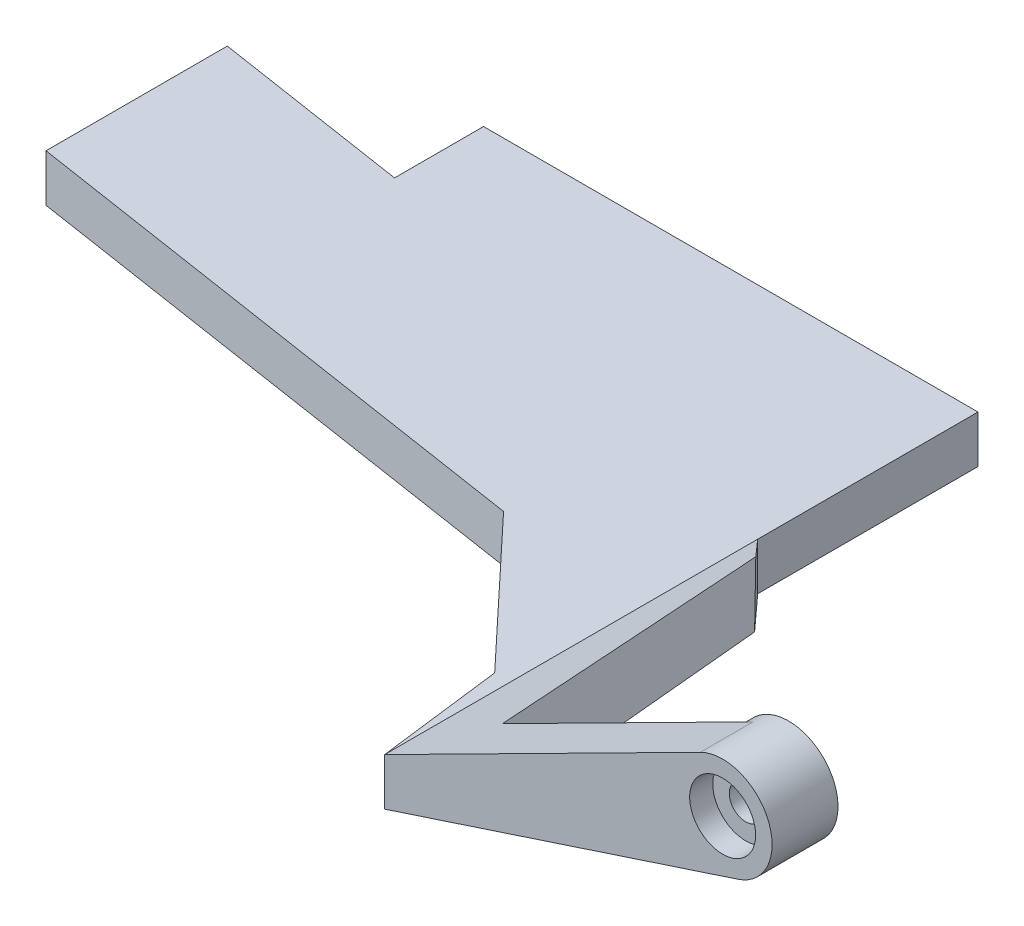
ISO-10303-21;
HEADER;
FILE_DESCRIPTION(('STEP AP214'),'2;1');
FILE_NAME('part.step','',(''),(''),'','','');
FILE_SCHEMA(('AUTOMOTIVE_DESIGN { 1 0 10303 214 1 1 1 1 }'));
ENDSEC;
DATA;
#1=APPLICATION_CONTEXT('core data for automotive mechanical design processes');
#2=APPLICATION_PROTOCOL_DEFINITION('international standard','automotive_design',2000,#1);
#3=PRODUCT_CONTEXT('',#1,'mechanical');
#4=PRODUCT('Part','Part','',(#3));
#5=PRODUCT_RELATED_PRODUCT_CATEGORY('part','',(#4));
#6=PRODUCT_DEFINITION_FORMATION('','',#4);
#7=PRODUCT_DEFINITION_CONTEXT('part definition',#1,'design');
#8=PRODUCT_DEFINITION('design','',#6,#7);
#9=PRODUCT_DEFINITION_SHAPE('','',#8);
#10=(LENGTH_UNIT() NAMED_UNIT(*) SI_UNIT(.MILLI.,.METRE.));
#11=(NAMED_UNIT(*) PLANE_ANGLE_UNIT() SI_UNIT($,.RADIAN.));
#12=(NAMED_UNIT(*) SI_UNIT($,.STERADIAN.) SOLID_ANGLE_UNIT());
#13=UNCERTAINTY_MEASURE_WITH_UNIT(LENGTH_MEASURE(1.E-05),#10,'distance_accuracy_value','');
#14=(GEOMETRIC_REPRESENTATION_CONTEXT(3) GLOBAL_UNCERTAINTY_ASSIGNED_CONTEXT((#13)) GLOBAL_UNIT_ASSIGNED_CONTEXT((#10,
#11,#12)) REPRESENTATION_CONTEXT('',''));
#15=CARTESIAN_POINT('',(0.,0.,0.));
#16=DIRECTION('',(0.,0.,1.));
#17=DIRECTION('',(1.,0.,0.));
#18=AXIS2_PLACEMENT_3D('',#15,#16,#17);
#19=CARTESIAN_POINT('',(-41.2676026719527,-17.5483263386241,-80.));
#20=DIRECTION('',(0.,1.,0.));
#21=DIRECTION('',(-1.,0.,0.));
#22=AXIS2_PLACEMENT_3D('',#19,#20,#21);
#23=PLANE('',#22);
#24=DIRECTION('',(-0.988277380271317,0.,-0.152668987171799));
#25=VECTOR('',#24,1.);
#26=CARTESIAN_POINT('',(-46.0414001066673,-17.5483263386241,-28.1514635135934));
#27=LINE('',#26,#25);
#28=CARTESIAN_POINT('',(-64.1813932684449,-17.5483263386243,-30.9537277752237));
#29=VERTEX_POINT('',#28);
#30=CARTESIAN_POINT('',(-146.267602671953,-17.5483263386243,-43.6343968875384));
#31=VERTEX_POINT('',#30);
#32=EDGE_CURVE('E76',#29,#31,#27,.T.);
#33=ORIENTED_EDGE('',*,*,#32,.F.);
#34=DIRECTION('',(-0.684229729304495,0.,-0.729266533947567));
#35=VECTOR('',#34,1.);
#36=CARTESIAN_POINT('',(-43.6545013893101,-17.5483263386241,-9.0757317567967));
#37=LINE('',#36,#35);
#38=CARTESIAN_POINT('',(-43.6545013893101,-17.5483263386241,-9.0757317567967));
#39=VERTEX_POINT('',#38);
#40=EDGE_CURVE('E323',#39,#29,#37,.T.);
#41=ORIENTED_EDGE('',*,*,#40,.F.);
#42=DIRECTION('',(-0.124159305403862,0.,-0.992262297420209));
#43=VECTOR('',#42,1.);
#44=CARTESIAN_POINT('',(-41.2676026719527,-17.5483263386241,10.));
#45=LINE('',#44,#43);
#46=CARTESIAN_POINT('',(-41.2676026719527,-17.5483263386241,10.));
#47=VERTEX_POINT('',#46);
#48=EDGE_CURVE('E289',#47,#39,#45,.T.);
#49=ORIENTED_EDGE('',*,*,#48,.F.);
#50=DIRECTION('',(0.,0.,1.));
#51=VECTOR('',#50,1.);
#52=CARTESIAN_POINT('',(-41.2676026719527,-17.5483263386241,2.));
#53=LINE('',#52,#51);
#54=CARTESIAN_POINT('',(-41.2676026719527,-17.5483263386241,-46.5823410297636));
#55=VERTEX_POINT('',#54);
#56=EDGE_CURVE('E219',#55,#47,#53,.T.);
#57=ORIENTED_EDGE('',*,*,#56,.F.);
#58=DIRECTION('',(0.,0.,1.));
#59=VECTOR('',#58,1.);
#60=CARTESIAN_POINT('',(-41.2676026719527,-17.5483263386241,-80.));
#61=LINE('',#60,#59);
#62=CARTESIAN_POINT('',(-41.2676026719527,-17.5483263386241,-80.));
#63=VERTEX_POINT('',#62);
#64=EDGE_CURVE('E260',#63,#55,#61,.T.);
#65=ORIENTED_EDGE('',*,*,#64,.F.);
#66=DIRECTION('',(-1.,0.,0.));
#67=VECTOR('',#66,1.);
#68=CARTESIAN_POINT('',(-41.2676026719527,-17.5483263386241,-80.));
#69=LINE('',#68,#67);
#70=CARTESIAN_POINT('',(-116.267602671953,-17.5483263386241,-80.));
#71=VERTEX_POINT('',#70);
#72=EDGE_CURVE('E228',#63,#71,#69,.T.);
#73=ORIENTED_EDGE('',*,*,#72,.T.);
#74=DIRECTION('',(0.,0.,1.));
#75=VECTOR('',#74,1.);
#76=CARTESIAN_POINT('',(-116.267602671953,-17.5483263386241,-80.));
#77=LINE('',#76,#75);
#78=CARTESIAN_POINT('',(-116.267602671953,-17.5483263386241,-66.5));
#79=VERTEX_POINT('',#78);
#80=EDGE_CURVE('E193',#71,#79,#77,.T.);
#81=ORIENTED_EDGE('',*,*,#80,.T.);
#82=DIRECTION('',(0.988277380271317,0.,0.152668987171799));
#83=VECTOR('',#82,1.);
#84=CARTESIAN_POINT('',(-146.267602671953,-17.5483263386243,-71.1343968875384));
#85=LINE('',#84,#83);
#86=CARTESIAN_POINT('',(-146.267602671953,-17.5483263386243,-71.1343968875384));
#87=VERTEX_POINT('',#86);
#88=EDGE_CURVE('E287',#87,#79,#85,.T.);
#89=ORIENTED_EDGE('',*,*,#88,.F.);
#90=DIRECTION('',(0.,0.,-1.));
#91=VECTOR('',#90,1.);
#92=CARTESIAN_POINT('',(-146.267602671953,-17.5483263386243,-59.5));
#93=LINE('',#92,#91);
#94=EDGE_CURVE('E280',#31,#87,#93,.T.);
#95=ORIENTED_EDGE('',*,*,#94,.F.);
#96=EDGE_LOOP('',(#33,#41,#49,#57,#65,#73,#81,#89,#95));
#97=FACE_BOUND('',#96,.T.);
#98=ADVANCED_FACE('F53',(#97),#23,.T.);
#99=CARTESIAN_POINT('',(-41.2676026719527,-24.7170529321878,-80.));
#100=DIRECTION('',(0.,1.,0.));
#101=DIRECTION('',(-1.,0.,0.));
#102=AXIS2_PLACEMENT_3D('',#99,#100,#101);
#103=PLANE('',#102);
#104=DIRECTION('',(0.,0.,1.));
#105=VECTOR('',#104,1.);
#106=CARTESIAN_POINT('',(-41.2676026719527,-24.7170529321878,-80.));
#107=LINE('',#106,#105);
#108=CARTESIAN_POINT('',(-41.2676026719527,-24.7170529321878,-80.));
#109=VERTEX_POINT('',#108);
#110=CARTESIAN_POINT('',(-41.2676026719527,-24.7170529321878,-46.5823410297636));
#111=VERTEX_POINT('',#110);
#112=EDGE_CURVE('E223',#109,#111,#107,.T.);
#113=ORIENTED_EDGE('',*,*,#112,.T.);
#114=DIRECTION('',(0.,0.,1.));
#115=VECTOR('',#114,1.);
#116=CARTESIAN_POINT('',(-41.2676026719527,-24.7170529321878,2.));
#117=LINE('',#116,#115);
#118=CARTESIAN_POINT('',(-41.2676026719527,-24.7170529321883,10.));
#119=VERTEX_POINT('',#118);
#120=EDGE_CURVE('E68',#111,#119,#117,.T.);
#121=ORIENTED_EDGE('',*,*,#120,.T.);
#122=DIRECTION('',(-0.124159305403862,0.,-0.992262297420209));
#123=VECTOR('',#122,1.);
#124=CARTESIAN_POINT('',(-41.2676026719527,-24.7170529321883,10.));
#125=LINE('',#124,#123);
#126=CARTESIAN_POINT('',(-43.65450138931,-24.7170529321878,-9.0757317567967));
#127=VERTEX_POINT('',#126);
#128=EDGE_CURVE('E301',#119,#127,#125,.T.);
#129=ORIENTED_EDGE('',*,*,#128,.T.);
#130=DIRECTION('',(-0.684229729304495,0.,-0.729266533947567));
#131=VECTOR('',#130,1.);
#132=CARTESIAN_POINT('',(-43.65450138931,-24.7170529321878,-9.0757317567967));
#133=LINE('',#132,#131);
#134=CARTESIAN_POINT('',(-64.1813932684448,-24.7170529321879,-30.9537277752237));
#135=VERTEX_POINT('',#134);
#136=EDGE_CURVE('E311',#127,#135,#133,.T.);
#137=ORIENTED_EDGE('',*,*,#136,.T.);
#138=DIRECTION('',(-0.988277380271317,0.,-0.152668987171799));
#139=VECTOR('',#138,1.);
#140=CARTESIAN_POINT('',(-46.0414001066673,-24.7170529321883,-28.1514635135934));
#141=LINE('',#140,#139);
#142=CARTESIAN_POINT('',(-146.267602671953,-24.7170529321885,-43.6343968875384));
#143=VERTEX_POINT('',#142);
#144=EDGE_CURVE('E175',#135,#143,#141,.T.);
#145=ORIENTED_EDGE('',*,*,#144,.T.);
#146=DIRECTION('',(0.,0.,-1.));
#147=VECTOR('',#146,1.);
#148=CARTESIAN_POINT('',(-146.267602671953,-24.7170529321885,-59.5));
#149=LINE('',#148,#147);
#150=CARTESIAN_POINT('',(-146.267602671953,-24.7170529321885,-71.1343968875384));
#151=VERTEX_POINT('',#150);
#152=EDGE_CURVE('E282',#143,#151,#149,.T.);
#153=ORIENTED_EDGE('',*,*,#152,.T.);
#154=DIRECTION('',(0.988277380271317,0.,0.152668987171799));
#155=VECTOR('',#154,1.);
#156=CARTESIAN_POINT('',(-146.267602671953,-24.7170529321885,-71.1343968875384));
#157=LINE('',#156,#155);
#158=CARTESIAN_POINT('',(-116.267602671953,-24.7170529321883,-66.5));
#159=VERTEX_POINT('',#158);
#160=EDGE_CURVE('E316',#151,#159,#157,.T.);
#161=ORIENTED_EDGE('',*,*,#160,.T.);
#162=DIRECTION('',(0.,0.,1.));
#163=VECTOR('',#162,1.);
#164=CARTESIAN_POINT('',(-116.267602671953,-24.7170529321883,-80.));
#165=LINE('',#164,#163);
#166=CARTESIAN_POINT('',(-116.267602671953,-24.7170529321883,-80.));
#167=VERTEX_POINT('',#166);
#168=EDGE_CURVE('E252',#167,#159,#165,.T.);
#169=ORIENTED_EDGE('',*,*,#168,.F.);
#170=DIRECTION('',(-1.,0.,0.));
#171=VECTOR('',#170,1.);
#172=CARTESIAN_POINT('',(-41.2676026719527,-24.7170529321878,-80.));
#173=LINE('',#172,#171);
#174=EDGE_CURVE('E256',#109,#167,#173,.T.);
#175=ORIENTED_EDGE('',*,*,#174,.F.);
#176=EDGE_LOOP('',(#113,#121,#129,#137,#145,#153,#161,#169,#175));
#177=FACE_BOUND('',#176,.T.);
#178=ADVANCED_FACE('F309',(#177),#103,.F.);
#179=CARTESIAN_POINT('',(-146.267602671953,-17.5483263386243,-59.5));
#180=DIRECTION('',(-1.,0.,0.));
#181=DIRECTION('',(0.,-1.,0.));
#182=AXIS2_PLACEMENT_3D('',#179,#180,#181);
#183=PLANE('',#182);
#184=ORIENTED_EDGE('',*,*,#152,.F.);
#185=DIRECTION('',(0.,1.,0.));
#186=VECTOR('',#185,1.);
#187=CARTESIAN_POINT('',(-146.267602671953,-17.5483263386243,-43.6343968875384));
#188=LINE('',#187,#186);
#189=EDGE_CURVE('E62',#143,#31,#188,.T.);
#190=ORIENTED_EDGE('',*,*,#189,.T.);
#191=ORIENTED_EDGE('',*,*,#94,.T.);
#192=DIRECTION('',(0.,-1.,0.));
#193=VECTOR('',#192,1.);
#194=CARTESIAN_POINT('',(-146.267602671953,-17.5483263386243,-71.1343968875384));
#195=LINE('',#194,#193);
#196=EDGE_CURVE('E298',#87,#151,#195,.T.);
#197=ORIENTED_EDGE('',*,*,#196,.T.);
#198=EDGE_LOOP('',(#184,#190,#191,#197));
#199=FACE_BOUND('',#198,.T.);
#200=ADVANCED_FACE('F278',(#199),#183,.T.);
#201=CARTESIAN_POINT('',(10.,0.,2.));
#202=DIRECTION('',(0.,0.,1.));
#203=DIRECTION('',(1.,0.,0.));
#204=AXIS2_PLACEMENT_3D('',#201,#202,#203);
#205=PLANE('',#204);
#206=CARTESIAN_POINT('',(10.,0.,2.));
#207=DIRECTION('',(0.,0.,-1.));
#208=DIRECTION('',(1.,0.,0.));
#209=AXIS2_PLACEMENT_3D('',#206,#207,#208);
#210=CIRCLE('',#209,7.5);
#211=CARTESIAN_POINT('',(12.3384512309936,-7.12612418080576,2.));
#212=VERTEX_POINT('',#211);
#213=CARTESIAN_POINT('',(6.61243550204485,6.69136807926405,2.));
#214=VERTEX_POINT('',#213);
#215=EDGE_CURVE('E215',#212,#214,#210,.T.);
#216=ORIENTED_EDGE('',*,*,#215,.F.);
#217=DIRECTION('',(0.950149890774101,0.311793497465814,0.));
#218=VECTOR('',#217,1.);
#219=CARTESIAN_POINT('',(-41.2676026719527,-24.7170529321878,2.));
#220=LINE('',#219,#218);
#221=CARTESIAN_POINT('',(-28.7525984690317,-20.6102304517378,2.));
#222=VERTEX_POINT('',#221);
#223=EDGE_CURVE('E181',#222,#212,#220,.T.);
#224=ORIENTED_EDGE('',*,*,#223,.F.);
#225=DIRECTION('',(0.311793497465814,-0.950149890774101,0.));
#226=VECTOR('',#225,1.);
#227=CARTESIAN_POINT('',(-45.588057242819,30.6936275345875,2.));
#228=LINE('',#227,#226);
#229=CARTESIAN_POINT('',(-31.397145388891,-12.5513197064078,2.));
#230=VERTEX_POINT('',#229);
#231=EDGE_CURVE('E167',#230,#222,#228,.T.);
#232=ORIENTED_EDGE('',*,*,#231,.F.);
#233=DIRECTION('',(-0.89218241056854,-0.45167526639402,0.));
#234=VECTOR('',#233,1.);
#235=CARTESIAN_POINT('',(-41.2676026719527,-17.5483263386241,2.));
#236=LINE('',#235,#234);
#237=EDGE_CURVE('E235',#214,#230,#236,.T.);
#238=ORIENTED_EDGE('',*,*,#237,.F.);
#239=EDGE_LOOP('',(#216,#224,#232,#238));
#240=FACE_BOUND('',#239,.T.);
#241=ADVANCED_FACE('F372',(#240),#205,.F.);
#242=CARTESIAN_POINT('',(-41.2676026719527,-24.7170529321878,2.));
#243=DIRECTION('',(0.311793497465814,-0.950149890774101,0.));
#244=DIRECTION('',(0.950149890774101,0.311793497465814,0.));
#245=AXIS2_PLACEMENT_3D('',#242,#243,#244);
#246=PLANE('',#245);
#247=DIRECTION('',(-0.130481720878271,-0.0428178253800029,-0.990525695954614));
#248=VECTOR('',#247,1.);
#249=CARTESIAN_POINT('',(-28.7525984690317,-20.6102304517378,2.));
#250=LINE('',#249,#248);
#251=CARTESIAN_POINT('',(-34.1535189881642,-22.3825528132373,-39.));
#252=VERTEX_POINT('',#251);
#253=EDGE_CURVE('E163',#222,#252,#250,.T.);
#254=ORIENTED_EDGE('',*,*,#253,.F.);
#255=ORIENTED_EDGE('',*,*,#223,.T.);
#256=DIRECTION('',(0.,0.,1.));
#257=VECTOR('',#256,1.);
#258=CARTESIAN_POINT('',(12.3384512309936,-7.12612418080576,2.));
#259=LINE('',#258,#257);
#260=CARTESIAN_POINT('',(12.3384512309936,-7.12612418080576,10.));
#261=VERTEX_POINT('',#260);
#262=EDGE_CURVE('E224',#212,#261,#259,.T.);
#263=ORIENTED_EDGE('',*,*,#262,.T.);
#264=DIRECTION('',(0.950149890774101,0.311793497465814,0.));
#265=VECTOR('',#264,1.);
#266=CARTESIAN_POINT('',(-41.2676026719527,-24.7170529321878,10.));
#267=LINE('',#266,#265);
#268=EDGE_CURVE('E198',#119,#261,#267,.T.);
#269=ORIENTED_EDGE('',*,*,#268,.F.);
#270=ORIENTED_EDGE('',*,*,#120,.F.);
#271=DIRECTION('',(0.667608146166294,0.219076885500904,0.711550898679516));
#272=VECTOR('',#271,1.);
#273=CARTESIAN_POINT('',(-33.0954907047821,-22.0353588156416,-37.8723310519922));
#274=LINE('',#273,#272);
#275=EDGE_CURVE('E12',#111,#252,#274,.T.);
#276=ORIENTED_EDGE('',*,*,#275,.T.);
#277=EDGE_LOOP('',(#254,#255,#263,#269,#270,#276));
#278=FACE_BOUND('',#277,.T.);
#279=ADVANCED_FACE('F55',(#278),#246,.T.);
#280=CARTESIAN_POINT('',(10.,0.,10.));
#281=DIRECTION('',(0.,0.,-1.));
#282=DIRECTION('',(-1.,0.,0.));
#283=AXIS2_PLACEMENT_3D('',#280,#281,#282);
#284=CYLINDRICAL_SURFACE('',#283,5.);
#285=CARTESIAN_POINT('',(10.,0.,3.));
#286=DIRECTION('',(0.,0.,1.));
#287=DIRECTION('',(1.,0.,0.));
#288=AXIS2_PLACEMENT_3D('',#285,#286,#287);
#289=CIRCLE('',#288,5.);
#290=CARTESIAN_POINT('',(15.,0.,3.));
#291=VERTEX_POINT('',#290);
#292=EDGE_CURVE('E188',#291,#291,#289,.T.);
#293=ORIENTED_EDGE('',*,*,#292,.T.);
#294=EDGE_LOOP('',(#293));
#295=FACE_BOUND('',#294,.T.);
#296=CARTESIAN_POINT('',(10.,0.,0.));
#297=DIRECTION('',(0.,0.,1.));
#298=DIRECTION('',(1.,0.,0.));
#299=AXIS2_PLACEMENT_3D('',#296,#297,#298);
#300=CIRCLE('',#299,5.);
#301=CARTESIAN_POINT('',(15.,0.,0.));
#302=VERTEX_POINT('',#301);
#303=EDGE_CURVE('E214',#302,#302,#300,.T.);
#304=ORIENTED_EDGE('',*,*,#303,.F.);
#305=EDGE_LOOP('',(#304));
#306=FACE_BOUND('',#305,.T.);
#307=ADVANCED_FACE('F380',(#295,#306),#284,.F.);
#308=CARTESIAN_POINT('',(10.,0.,3.));
#309=DIRECTION('',(0.,0.,1.));
#310=DIRECTION('',(1.,0.,0.));
#311=AXIS2_PLACEMENT_3D('',#308,#309,#310);
#312=CYLINDRICAL_SURFACE('',#311,2.49999999999999);
#313=CARTESIAN_POINT('',(10.,0.,3.));
#314=DIRECTION('',(0.,0.,1.));
#315=DIRECTION('',(1.,0.,0.));
#316=AXIS2_PLACEMENT_3D('',#313,#314,#315);
#317=CIRCLE('',#316,2.49999999999999);
#318=CARTESIAN_POINT('',(12.5,0.,3.));
#319=VERTEX_POINT('',#318);
#320=EDGE_CURVE('E194',#319,#319,#317,.T.);
#321=ORIENTED_EDGE('',*,*,#320,.F.);
#322=EDGE_LOOP('',(#321));
#323=FACE_BOUND('',#322,.T.);
#324=CARTESIAN_POINT('',(10.,0.,6.49999999999999));
#325=DIRECTION('',(0.,0.,1.));
#326=DIRECTION('',(1.,0.,0.));
#327=AXIS2_PLACEMENT_3D('',#324,#325,#326);
#328=CIRCLE('',#327,2.49999999999999);
#329=CARTESIAN_POINT('',(12.5,0.,6.49999999999999));
#330=VERTEX_POINT('',#329);
#331=EDGE_CURVE('E182',#330,#330,#328,.F.);
#332=ORIENTED_EDGE('',*,*,#331,.F.);
#333=EDGE_LOOP('',(#332));
#334=FACE_BOUND('',#333,.T.);
#335=ADVANCED_FACE('F410',(#323,#334),#312,.F.);
#336=CARTESIAN_POINT('',(0.,0.,10.));
#337=DIRECTION('',(0.,0.,1.));
#338=DIRECTION('',(1.,0.,0.));
#339=AXIS2_PLACEMENT_3D('',#336,#337,#338);
#340=PLANE('',#339);
#341=DIRECTION('',(0.,1.,0.));
#342=VECTOR('',#341,1.);
#343=CARTESIAN_POINT('',(-41.2676026719527,-24.7170529321883,10.));
#344=LINE('',#343,#342);
#345=EDGE_CURVE('E169',#119,#47,#344,.T.);
#346=ORIENTED_EDGE('',*,*,#345,.F.);
#347=ORIENTED_EDGE('',*,*,#268,.T.);
#348=CARTESIAN_POINT('',(10.,0.,10.));
#349=DIRECTION('',(0.,0.,1.));
#350=DIRECTION('',(1.,0.,0.));
#351=AXIS2_PLACEMENT_3D('',#348,#349,#350);
#352=CIRCLE('',#351,7.5);
#353=CARTESIAN_POINT('',(6.61243550204485,6.69136807926405,10.));
#354=VERTEX_POINT('',#353);
#355=EDGE_CURVE('E192',#261,#354,#352,.T.);
#356=ORIENTED_EDGE('',*,*,#355,.T.);
#357=DIRECTION('',(-0.89218241056854,-0.45167526639402,0.));
#358=VECTOR('',#357,1.);
#359=CARTESIAN_POINT('',(-41.2676026719527,-17.5483263386241,10.));
#360=LINE('',#359,#358);
#361=EDGE_CURVE('E209',#354,#47,#360,.T.);
#362=ORIENTED_EDGE('',*,*,#361,.T.);
#363=EDGE_LOOP('',(#346,#347,#356,#362));
#364=FACE_BOUND('',#363,.T.);
#365=CARTESIAN_POINT('',(10.,0.,10.));
#366=DIRECTION('',(0.,0.,1.));
#367=DIRECTION('',(1.,0.,0.));
#368=AXIS2_PLACEMENT_3D('',#365,#366,#367);
#369=CIRCLE('',#368,5.);
#370=CARTESIAN_POINT('',(15.,0.,10.));
#371=VERTEX_POINT('',#370);
#372=EDGE_CURVE('E186',#371,#371,#369,.T.);
#373=ORIENTED_EDGE('',*,*,#372,.F.);
#374=EDGE_LOOP('',(#373));
#375=FACE_BOUND('',#374,.T.);
#376=ADVANCED_FACE('F360',(#364,#375),#340,.T.);
#377=CARTESIAN_POINT('',(10.,0.,3.));
#378=DIRECTION('',(0.,0.,1.));
#379=DIRECTION('',(1.,0.,0.));
#380=AXIS2_PLACEMENT_3D('',#377,#378,#379);
#381=PLANE('',#380);
#382=ORIENTED_EDGE('',*,*,#320,.T.);
#383=EDGE_LOOP('',(#382));
#384=FACE_BOUND('',#383,.T.);
#385=ORIENTED_EDGE('',*,*,#292,.F.);
#386=EDGE_LOOP('',(#385));
#387=FACE_BOUND('',#386,.T.);
#388=ADVANCED_FACE('F409',(#384,#387),#381,.F.);
#389=CARTESIAN_POINT('',(10.,0.,6.49999999999999));
#390=DIRECTION('',(0.,0.,1.));
#391=DIRECTION('',(1.,0.,0.));
#392=AXIS2_PLACEMENT_3D('',#389,#390,#391);
#393=PLANE('',#392);
#394=CARTESIAN_POINT('',(10.,0.,6.49999999999999));
#395=DIRECTION('',(0.,0.,1.));
#396=DIRECTION('',(1.,0.,0.));
#397=AXIS2_PLACEMENT_3D('',#394,#395,#396);
#398=CIRCLE('',#397,5.);
#399=CARTESIAN_POINT('',(15.,0.,6.49999999999999));
#400=VERTEX_POINT('',#399);
#401=EDGE_CURVE('E187',#400,#400,#398,.T.);
#402=ORIENTED_EDGE('',*,*,#401,.T.);
#403=EDGE_LOOP('',(#402));
#404=FACE_BOUND('',#403,.T.);
#405=ORIENTED_EDGE('',*,*,#331,.T.);
#406=EDGE_LOOP('',(#405));
#407=FACE_BOUND('',#406,.T.);
#408=ADVANCED_FACE('F416',(#404,#407),#393,.T.);
#409=CARTESIAN_POINT('',(10.,0.,6.49999999999999));
#410=DIRECTION('',(0.,0.,1.));
#411=DIRECTION('',(1.,0.,0.));
#412=AXIS2_PLACEMENT_3D('',#409,#410,#411);
#413=CYLINDRICAL_SURFACE('',#412,5.);
#414=ORIENTED_EDGE('',*,*,#401,.F.);
#415=EDGE_LOOP('',(#414));
#416=FACE_BOUND('',#415,.T.);
#417=ORIENTED_EDGE('',*,*,#372,.T.);
#418=EDGE_LOOP('',(#417));
#419=FACE_BOUND('',#418,.T.);
#420=ADVANCED_FACE('F421',(#416,#419),#413,.F.);
#421=CARTESIAN_POINT('',(10.,0.,0.));
#422=DIRECTION('',(0.,0.,1.));
#423=DIRECTION('',(1.,0.,0.));
#424=AXIS2_PLACEMENT_3D('',#421,#422,#423);
#425=CYLINDRICAL_SURFACE('',#424,7.5);
#426=DIRECTION('',(0.,0.,1.));
#427=VECTOR('',#426,1.);
#428=CARTESIAN_POINT('',(6.61243550204485,6.69136807926405,2.));
#429=LINE('',#428,#427);
#430=EDGE_CURVE('E202',#214,#354,#429,.T.);
#431=ORIENTED_EDGE('',*,*,#430,.T.);
#432=ORIENTED_EDGE('',*,*,#355,.F.);
#433=ORIENTED_EDGE('',*,*,#262,.F.);
#434=ORIENTED_EDGE('',*,*,#215,.T.);
#435=EDGE_LOOP('',(#431,#432,#433,#434));
#436=FACE_BOUND('',#435,.T.);
#437=CARTESIAN_POINT('',(10.,0.,0.));
#438=DIRECTION('',(0.,0.,1.));
#439=DIRECTION('',(1.,0.,0.));
#440=AXIS2_PLACEMENT_3D('',#437,#438,#439);
#441=CIRCLE('',#440,7.5);
#442=CARTESIAN_POINT('',(17.5,0.,0.));
#443=VERTEX_POINT('',#442);
#444=EDGE_CURVE('E210',#443,#443,#441,.T.);
#445=ORIENTED_EDGE('',*,*,#444,.T.);
#446=EDGE_LOOP('',(#445));
#447=FACE_BOUND('',#446,.T.);
#448=ADVANCED_FACE('F366',(#436,#447),#425,.T.);
#449=CARTESIAN_POINT('',(10.,0.,0.));
#450=DIRECTION('',(0.,0.,1.));
#451=DIRECTION('',(1.,0.,0.));
#452=AXIS2_PLACEMENT_3D('',#449,#450,#451);
#453=PLANE('',#452);
#454=ORIENTED_EDGE('',*,*,#303,.T.);
#455=EDGE_LOOP('',(#454));
#456=FACE_BOUND('',#455,.T.);
#457=ORIENTED_EDGE('',*,*,#444,.F.);
#458=EDGE_LOOP('',(#457));
#459=FACE_BOUND('',#458,.T.);
#460=ADVANCED_FACE('F430',(#456,#459),#453,.F.);
#461=CARTESIAN_POINT('',(-41.2676026719527,-17.5483263386241,2.));
#462=DIRECTION('',(-0.45167526639402,0.89218241056854,0.));
#463=DIRECTION('',(-0.89218241056854,-0.45167526639402,0.));
#464=AXIS2_PLACEMENT_3D('',#461,#462,#463);
#465=PLANE('',#464);
#466=DIRECTION('',(0.123914754910578,0.0627329448231545,0.990307887047895));
#467=VECTOR('',#466,1.);
#468=CARTESIAN_POINT('',(-31.5875493609701,-12.6477134077323,0.478320395248819));
#469=LINE('',#468,#467);
#470=CARTESIAN_POINT('',(-36.8926768928072,-15.3334813211232,-41.9194524959982));
#471=VERTEX_POINT('',#470);
#472=EDGE_CURVE('E173',#471,#230,#469,.T.);
#473=ORIENTED_EDGE('',*,*,#472,.F.);
#474=DIRECTION('',(-0.646538879477244,-0.327316047887437,-0.689094828103983));
#475=VECTOR('',#474,1.);
#476=CARTESIAN_POINT('',(-34.4078437346935,-14.0755124737879,-39.2710647001367));
#477=LINE('',#476,#475);
#478=EDGE_CURVE('E156',#471,#55,#477,.T.);
#479=ORIENTED_EDGE('',*,*,#478,.T.);
#480=ORIENTED_EDGE('',*,*,#56,.T.);
#481=ORIENTED_EDGE('',*,*,#361,.F.);
#482=ORIENTED_EDGE('',*,*,#430,.F.);
#483=ORIENTED_EDGE('',*,*,#237,.T.);
#484=EDGE_LOOP('',(#473,#479,#480,#481,#482,#483));
#485=FACE_BOUND('',#484,.T.);
#486=ADVANCED_FACE('F370',(#485),#465,.T.);
#487=CARTESIAN_POINT('',(-41.2676026719527,-24.7170529321878,-80.));
#488=DIRECTION('',(1.,0.,0.));
#489=DIRECTION('',(0.,0.,-1.));
#490=AXIS2_PLACEMENT_3D('',#487,#488,#489);
#491=PLANE('',#490);
#492=DIRECTION('',(0.,-1.,0.));
#493=VECTOR('',#492,1.);
#494=CARTESIAN_POINT('',(-41.2676026719528,-15.1485430259318,-46.5823410297636));
#495=LINE('',#494,#493);
#496=EDGE_CURVE('E348',#55,#111,#495,.T.);
#497=ORIENTED_EDGE('',*,*,#496,.T.);
#498=ORIENTED_EDGE('',*,*,#112,.F.);
#499=DIRECTION('',(0.,1.,0.));
#500=VECTOR('',#499,1.);
#501=CARTESIAN_POINT('',(-41.2676026719527,-24.7170529321878,-80.));
#502=LINE('',#501,#500);
#503=EDGE_CURVE('E243',#109,#63,#502,.T.);
#504=ORIENTED_EDGE('',*,*,#503,.T.);
#505=ORIENTED_EDGE('',*,*,#64,.T.);
#506=EDGE_LOOP('',(#497,#498,#504,#505));
#507=FACE_BOUND('',#506,.T.);
#508=ADVANCED_FACE('F347',(#507),#491,.T.);
#509=CARTESIAN_POINT('',(-116.267602671953,-17.5483263386241,-80.));
#510=DIRECTION('',(-1.,0.,0.));
#511=DIRECTION('',(0.,0.,1.));
#512=AXIS2_PLACEMENT_3D('',#509,#510,#511);
#513=PLANE('',#512);
#514=DIRECTION('',(0.,-1.,0.));
#515=VECTOR('',#514,1.);
#516=CARTESIAN_POINT('',(-116.267602671953,-17.5483263386241,-66.5));
#517=LINE('',#516,#515);
#518=EDGE_CURVE('E295',#79,#159,#517,.T.);
#519=ORIENTED_EDGE('',*,*,#518,.F.);
#520=ORIENTED_EDGE('',*,*,#80,.F.);
#521=DIRECTION('',(0.,-1.,0.));
#522=VECTOR('',#521,1.);
#523=CARTESIAN_POINT('',(-116.267602671953,-17.5483263386241,-80.));
#524=LINE('',#523,#522);
#525=EDGE_CURVE('E222',#71,#167,#524,.T.);
#526=ORIENTED_EDGE('',*,*,#525,.T.);
#527=ORIENTED_EDGE('',*,*,#168,.T.);
#528=EDGE_LOOP('',(#519,#520,#526,#527));
#529=FACE_BOUND('',#528,.T.);
#530=ADVANCED_FACE('F338',(#529),#513,.T.);
#531=CARTESIAN_POINT('',(0.,0.,-80.));
#532=DIRECTION('',(0.,0.,1.));
#533=DIRECTION('',(1.,0.,0.));
#534=AXIS2_PLACEMENT_3D('',#531,#532,#533);
#535=PLANE('',#534);
#536=ORIENTED_EDGE('',*,*,#72,.F.);
#537=ORIENTED_EDGE('',*,*,#503,.F.);
#538=ORIENTED_EDGE('',*,*,#174,.T.);
#539=ORIENTED_EDGE('',*,*,#525,.F.);
#540=EDGE_LOOP('',(#536,#537,#538,#539));
#541=FACE_BOUND('',#540,.T.);
#542=ADVANCED_FACE('F342',(#541),#535,.F.);
#543=CARTESIAN_POINT('',(-45.588057242819,30.6936275345875,2.));
#544=DIRECTION('',(-0.941147881820217,-0.308839471071449,0.137327512369617));
#545=DIRECTION('',(0.311793497465814,-0.950149890774101,0.));
#546=AXIS2_PLACEMENT_3D('',#543,#544,#545);
#547=PLANE('',#546);
#548=ORIENTED_EDGE('',*,*,#472,.T.);
#549=ORIENTED_EDGE('',*,*,#231,.T.);
#550=ORIENTED_EDGE('',*,*,#253,.T.);
#551=DIRECTION('',(-0.337895834039163,0.869556255589427,-0.360136534809055));
#552=VECTOR('',#551,1.);
#553=CARTESIAN_POINT('',(-36.2790116655263,-16.9127148702354,-41.2653951024993));
#554=LINE('',#553,#552);
#555=EDGE_CURVE('E152',#252,#471,#554,.T.);
#556=ORIENTED_EDGE('',*,*,#555,.T.);
#557=EDGE_LOOP('',(#548,#549,#550,#556));
#558=FACE_BOUND('',#557,.T.);
#559=ADVANCED_FACE('F165',(#558),#547,.F.);
#560=CARTESIAN_POINT('',(-46.0414001066673,-24.7170529321883,-28.1514635135934));
#561=DIRECTION('',(0.152668987171799,0.,-0.988277380271317));
#562=DIRECTION('',(-0.988277380271317,0.,-0.152668987171799));
#563=AXIS2_PLACEMENT_3D('',#560,#561,#562);
#564=PLANE('',#563);
#565=ORIENTED_EDGE('',*,*,#144,.F.);
#566=DIRECTION('',(0.,-1.,0.));
#567=VECTOR('',#566,1.);
#568=CARTESIAN_POINT('',(-64.1813932684449,-17.5483263386243,-30.9537277752237));
#569=LINE('',#568,#567);
#570=EDGE_CURVE('E313',#29,#135,#569,.T.);
#571=ORIENTED_EDGE('',*,*,#570,.F.);
#572=ORIENTED_EDGE('',*,*,#32,.T.);
#573=ORIENTED_EDGE('',*,*,#189,.F.);
#574=EDGE_LOOP('',(#565,#571,#572,#573));
#575=FACE_BOUND('',#574,.T.);
#576=ADVANCED_FACE('F312',(#575),#564,.F.);
#577=CARTESIAN_POINT('',(-41.2676026719527,-24.7170529321883,10.));
#578=DIRECTION('',(0.992262297420209,0.,-0.124159305403862));
#579=DIRECTION('',(-0.124159305403862,0.,-0.992262297420209));
#580=AXIS2_PLACEMENT_3D('',#577,#578,#579);
#581=PLANE('',#580);
#582=ORIENTED_EDGE('',*,*,#48,.T.);
#583=DIRECTION('',(0.,-1.,0.));
#584=VECTOR('',#583,1.);
#585=CARTESIAN_POINT('',(-43.6545013893101,-17.5483263386241,-9.0757317567967));
#586=LINE('',#585,#584);
#587=EDGE_CURVE('E317',#39,#127,#586,.T.);
#588=ORIENTED_EDGE('',*,*,#587,.T.);
#589=ORIENTED_EDGE('',*,*,#128,.F.);
#590=ORIENTED_EDGE('',*,*,#345,.T.);
#591=EDGE_LOOP('',(#582,#588,#589,#590));
#592=FACE_BOUND('',#591,.T.);
#593=ADVANCED_FACE('F357',(#592),#581,.F.);
#594=CARTESIAN_POINT('',(-146.267602671953,-17.5483263386243,-71.1343968875384));
#595=DIRECTION('',(0.152668987171799,0.,-0.988277380271317));
#596=DIRECTION('',(-0.988277380271317,0.,-0.152668987171799));
#597=AXIS2_PLACEMENT_3D('',#594,#595,#596);
#598=PLANE('',#597);
#599=ORIENTED_EDGE('',*,*,#160,.F.);
#600=ORIENTED_EDGE('',*,*,#196,.F.);
#601=ORIENTED_EDGE('',*,*,#88,.T.);
#602=ORIENTED_EDGE('',*,*,#518,.T.);
#603=EDGE_LOOP('',(#599,#600,#601,#602));
#604=FACE_BOUND('',#603,.T.);
#605=ADVANCED_FACE('F334',(#604),#598,.T.);
#606=CARTESIAN_POINT('',(-43.6545013893101,-17.5483263386241,-9.0757317567967));
#607=DIRECTION('',(-0.729266533947567,0.,0.684229729304495));
#608=DIRECTION('',(0.684229729304495,0.,0.729266533947567));
#609=AXIS2_PLACEMENT_3D('',#606,#607,#608);
#610=PLANE('',#609);
#611=ORIENTED_EDGE('',*,*,#136,.F.);
#612=ORIENTED_EDGE('',*,*,#587,.F.);
#613=ORIENTED_EDGE('',*,*,#40,.T.);
#614=ORIENTED_EDGE('',*,*,#570,.T.);
#615=EDGE_LOOP('',(#611,#612,#613,#614));
#616=FACE_BOUND('',#615,.T.);
#617=ADVANCED_FACE('F355',(#616),#610,.T.);
#618=CARTESIAN_POINT('',(-34.1535189881641,-15.1485430259318,-39.));
#619=DIRECTION('',(0.729266533947567,0.,-0.684229729304495));
#620=DIRECTION('',(-0.684229729304495,0.,-0.729266533947567));
#621=AXIS2_PLACEMENT_3D('',#618,#619,#620);
#622=PLANE('',#621);
#623=ORIENTED_EDGE('',*,*,#555,.F.);
#624=ORIENTED_EDGE('',*,*,#275,.F.);
#625=ORIENTED_EDGE('',*,*,#496,.F.);
#626=ORIENTED_EDGE('',*,*,#478,.F.);
#627=EDGE_LOOP('',(#623,#624,#625,#626));
#628=FACE_BOUND('',#627,.T.);
#629=ADVANCED_FACE('F153',(#628),#622,.T.);
#630=CLOSED_SHELL('',(#98,#178,#200,#241,#279,#307,#335,#376,#388,#408,#420,#448,#460,#486,#508,
#530,#542,#559,#576,#593,#605,#617,#629));
#631=MANIFOLD_SOLID_BREP('B2',#630);
#632=ADVANCED_BREP_SHAPE_REPRESENTATION('',(#18,#631),#14);
#633=SHAPE_DEFINITION_REPRESENTATION(#9,#632);
ENDSEC;
END-ISO-10303-21;
